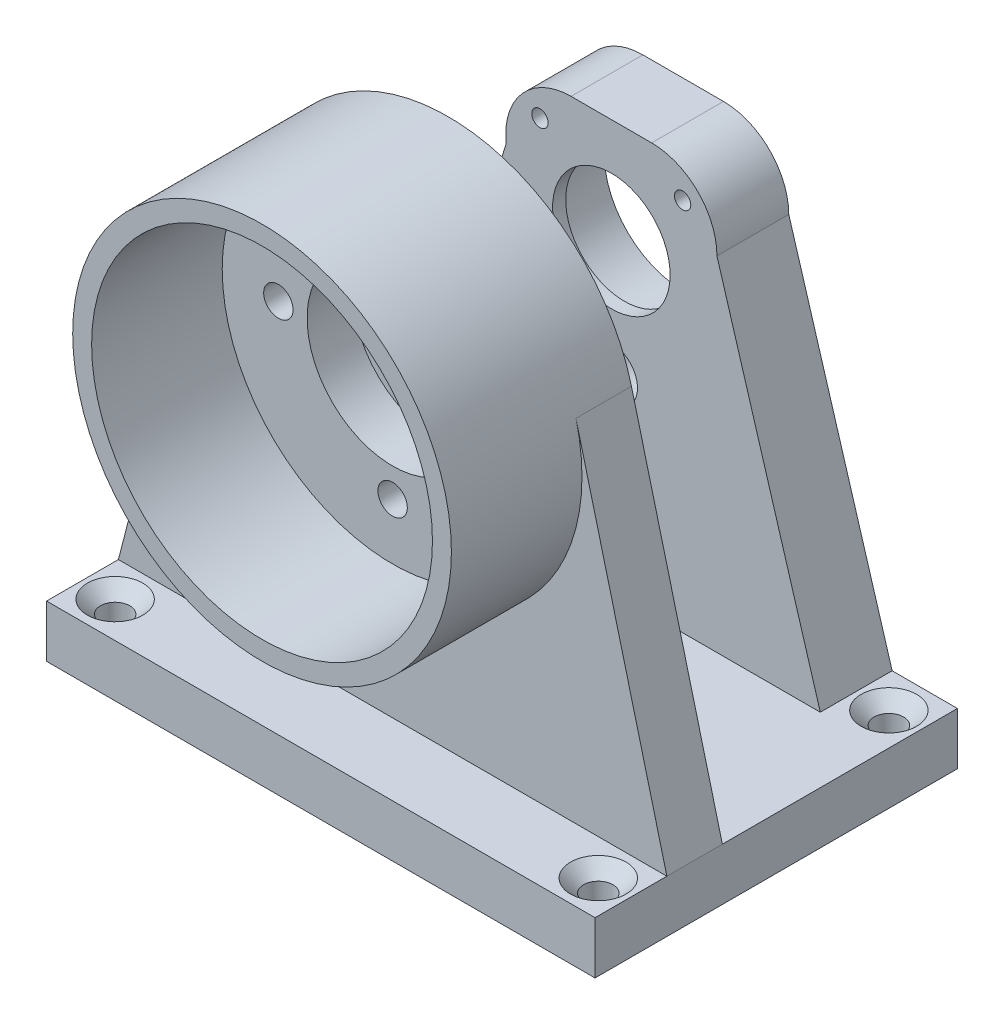
ISO-10303-21;
HEADER;
FILE_DESCRIPTION(('STEP AP214'),'2;1');
FILE_NAME('part.step','',(''),(''),'','','');
FILE_SCHEMA(('AUTOMOTIVE_DESIGN { 1 0 10303 214 1 1 1 1 }'));
ENDSEC;
DATA;
#1=APPLICATION_CONTEXT('core data for automotive mechanical design processes');
#2=APPLICATION_PROTOCOL_DEFINITION('international standard','automotive_design',2000,#1);
#3=PRODUCT_CONTEXT('',#1,'mechanical');
#4=PRODUCT('Part','Part','',(#3));
#5=PRODUCT_RELATED_PRODUCT_CATEGORY('part','',(#4));
#6=PRODUCT_DEFINITION_FORMATION('','',#4);
#7=PRODUCT_DEFINITION_CONTEXT('part definition',#1,'design');
#8=PRODUCT_DEFINITION('design','',#6,#7);
#9=PRODUCT_DEFINITION_SHAPE('','',#8);
#10=(LENGTH_UNIT() NAMED_UNIT(*) SI_UNIT(.MILLI.,.METRE.));
#11=(NAMED_UNIT(*) PLANE_ANGLE_UNIT() SI_UNIT($,.RADIAN.));
#12=(NAMED_UNIT(*) SI_UNIT($,.STERADIAN.) SOLID_ANGLE_UNIT());
#13=UNCERTAINTY_MEASURE_WITH_UNIT(LENGTH_MEASURE(1.E-05),#10,'distance_accuracy_value','');
#14=(GEOMETRIC_REPRESENTATION_CONTEXT(3) GLOBAL_UNCERTAINTY_ASSIGNED_CONTEXT((#13)) GLOBAL_UNIT_ASSIGNED_CONTEXT((#10,
#11,#12)) REPRESENTATION_CONTEXT('',''));
#15=CARTESIAN_POINT('',(0.,0.,0.));
#16=DIRECTION('',(0.,0.,1.));
#17=DIRECTION('',(1.,0.,0.));
#18=AXIS2_PLACEMENT_3D('',#15,#16,#17);
#19=CARTESIAN_POINT('',(0.,0.,44.5));
#20=DIRECTION('',(0.,0.,1.));
#21=DIRECTION('',(1.,0.,0.));
#22=AXIS2_PLACEMENT_3D('',#19,#20,#21);
#23=PLANE('',#22);
#24=CARTESIAN_POINT('',(0.,0.,44.5));
#25=DIRECTION('',(0.,0.,1.));
#26=DIRECTION('',(1.,0.,0.));
#27=AXIS2_PLACEMENT_3D('',#24,#25,#26);
#28=CIRCLE('',#27,13.1);
#29=CARTESIAN_POINT('',(13.1,0.,44.5));
#30=VERTEX_POINT('',#29);
#31=EDGE_CURVE('E264',#30,#30,#28,.T.);
#32=ORIENTED_EDGE('',*,*,#31,.F.);
#33=EDGE_LOOP('',(#32));
#34=FACE_BOUND('',#33,.T.);
#35=CARTESIAN_POINT('',(0.,17.5,44.5));
#36=DIRECTION('',(0.,0.,1.));
#37=DIRECTION('',(1.,0.,0.));
#38=AXIS2_PLACEMENT_3D('',#35,#36,#37);
#39=CIRCLE('',#38,2.25);
#40=CARTESIAN_POINT('',(2.25,17.5,44.5));
#41=VERTEX_POINT('',#40);
#42=EDGE_CURVE('E272',#41,#41,#39,.T.);
#43=ORIENTED_EDGE('',*,*,#42,.F.);
#44=EDGE_LOOP('',(#43));
#45=FACE_BOUND('',#44,.T.);
#46=CARTESIAN_POINT('',(0.,-17.5,44.5));
#47=DIRECTION('',(0.,0.,1.));
#48=DIRECTION('',(1.,0.,0.));
#49=AXIS2_PLACEMENT_3D('',#46,#47,#48);
#50=CIRCLE('',#49,2.25);
#51=CARTESIAN_POINT('',(2.25,-17.5,44.5));
#52=VERTEX_POINT('',#51);
#53=EDGE_CURVE('E278',#52,#52,#50,.T.);
#54=ORIENTED_EDGE('',*,*,#53,.F.);
#55=EDGE_LOOP('',(#54));
#56=FACE_BOUND('',#55,.T.);
#57=CARTESIAN_POINT('',(17.5,0.,44.5));
#58=DIRECTION('',(0.,0.,1.));
#59=DIRECTION('',(1.,0.,0.));
#60=AXIS2_PLACEMENT_3D('',#57,#58,#59);
#61=CIRCLE('',#60,2.25);
#62=CARTESIAN_POINT('',(19.75,0.,44.5));
#63=VERTEX_POINT('',#62);
#64=EDGE_CURVE('E275',#63,#63,#61,.T.);
#65=ORIENTED_EDGE('',*,*,#64,.F.);
#66=EDGE_LOOP('',(#65));
#67=FACE_BOUND('',#66,.T.);
#68=CARTESIAN_POINT('',(-17.5,0.,44.5));
#69=DIRECTION('',(0.,0.,1.));
#70=DIRECTION('',(1.,0.,0.));
#71=AXIS2_PLACEMENT_3D('',#68,#69,#70);
#72=CIRCLE('',#71,2.25);
#73=CARTESIAN_POINT('',(-15.25,0.,44.5));
#74=VERTEX_POINT('',#73);
#75=EDGE_CURVE('E267',#74,#74,#72,.T.);
#76=ORIENTED_EDGE('',*,*,#75,.F.);
#77=EDGE_LOOP('',(#76));
#78=FACE_BOUND('',#77,.T.);
#79=CARTESIAN_POINT('',(0.,0.,44.5));
#80=DIRECTION('',(0.,0.,1.));
#81=DIRECTION('',(1.,0.,0.));
#82=AXIS2_PLACEMENT_3D('',#79,#80,#81);
#83=CIRCLE('',#82,26.1);
#84=CARTESIAN_POINT('',(26.1,0.,44.5));
#85=VERTEX_POINT('',#84);
#86=EDGE_CURVE('E250',#85,#85,#83,.T.);
#87=ORIENTED_EDGE('',*,*,#86,.T.);
#88=EDGE_LOOP('',(#87));
#89=FACE_BOUND('',#88,.T.);
#90=ADVANCED_FACE('F36',(#34,#45,#56,#67,#78,#89),#23,.T.);
#91=CARTESIAN_POINT('',(0.,0.,37.5));
#92=DIRECTION('',(0.,0.,1.));
#93=DIRECTION('',(1.,0.,0.));
#94=AXIS2_PLACEMENT_3D('',#91,#92,#93);
#95=PLANE('',#94);
#96=CARTESIAN_POINT('',(0.,0.,37.5));
#97=DIRECTION('',(0.,0.,1.));
#98=DIRECTION('',(1.,0.,0.));
#99=AXIS2_PLACEMENT_3D('',#96,#97,#98);
#100=CIRCLE('',#99,6.);
#101=CARTESIAN_POINT('',(6.,0.,37.5));
#102=VERTEX_POINT('',#101);
#103=EDGE_CURVE('E288',#102,#102,#100,.T.);
#104=ORIENTED_EDGE('',*,*,#103,.F.);
#105=EDGE_LOOP('',(#104));
#106=FACE_BOUND('',#105,.T.);
#107=CARTESIAN_POINT('',(0.,0.,37.5));
#108=DIRECTION('',(0.,0.,1.));
#109=DIRECTION('',(1.,0.,0.));
#110=AXIS2_PLACEMENT_3D('',#107,#108,#109);
#111=CIRCLE('',#110,13.1);
#112=CARTESIAN_POINT('',(13.1,0.,37.5));
#113=VERTEX_POINT('',#112);
#114=EDGE_CURVE('E261',#113,#113,#111,.T.);
#115=ORIENTED_EDGE('',*,*,#114,.T.);
#116=EDGE_LOOP('',(#115));
#117=FACE_BOUND('',#116,.T.);
#118=ADVANCED_FACE('F447',(#106,#117),#95,.T.);
#119=CARTESIAN_POINT('',(0.,0.,11.));
#120=DIRECTION('',(0.,0.,-1.));
#121=DIRECTION('',(-1.,0.,0.));
#122=AXIS2_PLACEMENT_3D('',#119,#120,#121);
#123=CYLINDRICAL_SURFACE('',#122,12.1);
#124=CARTESIAN_POINT('',(0.,0.,0.));
#125=DIRECTION('',(0.,0.,1.));
#126=DIRECTION('',(1.,0.,0.));
#127=AXIS2_PLACEMENT_3D('',#124,#125,#126);
#128=CIRCLE('',#127,12.1);
#129=CARTESIAN_POINT('',(12.1,0.,0.));
#130=VERTEX_POINT('',#129);
#131=EDGE_CURVE('E146',#130,#130,#128,.T.);
#132=ORIENTED_EDGE('',*,*,#131,.F.);
#133=EDGE_LOOP('',(#132));
#134=FACE_BOUND('',#133,.T.);
#135=CARTESIAN_POINT('',(0.,0.,9.));
#136=DIRECTION('',(0.,0.,1.));
#137=DIRECTION('',(1.,0.,0.));
#138=AXIS2_PLACEMENT_3D('',#135,#136,#137);
#139=CIRCLE('',#138,12.1);
#140=CARTESIAN_POINT('',(12.1,0.,9.));
#141=VERTEX_POINT('',#140);
#142=EDGE_CURVE('E352',#141,#141,#139,.T.);
#143=ORIENTED_EDGE('',*,*,#142,.T.);
#144=EDGE_LOOP('',(#143));
#145=FACE_BOUND('',#144,.T.);
#146=ADVANCED_FACE('F453',(#134,#145),#123,.F.);
#147=CARTESIAN_POINT('',(6.17131132464449,6.1,11.));
#148=DIRECTION('',(0.,0.,1.));
#149=DIRECTION('',(1.,0.,0.));
#150=AXIS2_PLACEMENT_3D('',#147,#148,#149);
#151=PLANE('',#150);
#152=CARTESIAN_POINT('',(0.,-17.5,11.));
#153=DIRECTION('',(0.,0.,1.));
#154=DIRECTION('',(1.,0.,0.));
#155=AXIS2_PLACEMENT_3D('',#152,#153,#154);
#156=CIRCLE('',#155,4.);
#157=CARTESIAN_POINT('',(4.,-17.5,11.));
#158=VERTEX_POINT('',#157);
#159=EDGE_CURVE('E246',#158,#158,#156,.F.);
#160=ORIENTED_EDGE('',*,*,#159,.T.);
#161=EDGE_LOOP('',(#160));
#162=FACE_BOUND('',#161,.T.);
#163=DIRECTION('',(-1.,0.,0.));
#164=VECTOR('',#163,1.);
#165=CARTESIAN_POINT('',(-42.,-46.5,11.));
#166=LINE('',#165,#164);
#167=CARTESIAN_POINT('',(32.,-46.5,11.));
#168=VERTEX_POINT('',#167);
#169=CARTESIAN_POINT('',(-32.,-46.5,11.));
#170=VERTEX_POINT('',#169);
#171=EDGE_CURVE('E103',#168,#170,#166,.T.);
#172=ORIENTED_EDGE('',*,*,#171,.F.);
#173=DIRECTION('',(-0.288160971359315,0.957581983218803,0.));
#174=VECTOR('',#173,1.);
#175=CARTESIAN_POINT('',(32.,-46.5,11.));
#176=LINE('',#175,#174);
#177=CARTESIAN_POINT('',(16.1713113246445,6.09999999999993,11.));
#178=VERTEX_POINT('',#177);
#179=EDGE_CURVE('E161',#168,#178,#176,.T.);
#180=ORIENTED_EDGE('',*,*,#179,.T.);
#181=CARTESIAN_POINT('',(6.17131132464449,6.1,11.));
#182=DIRECTION('',(0.,0.,1.));
#183=DIRECTION('',(1.,0.,0.));
#184=AXIS2_PLACEMENT_3D('',#181,#182,#183);
#185=CIRCLE('',#184,10.);
#186=CARTESIAN_POINT('',(6.17131132464449,16.1,11.));
#187=VERTEX_POINT('',#186);
#188=EDGE_CURVE('E121',#178,#187,#185,.T.);
#189=ORIENTED_EDGE('',*,*,#188,.T.);
#190=DIRECTION('',(-1.,0.,0.));
#191=VECTOR('',#190,1.);
#192=CARTESIAN_POINT('',(-6.17131132464449,16.1,11.));
#193=LINE('',#192,#191);
#194=CARTESIAN_POINT('',(-6.17131132464449,16.1,11.));
#195=VERTEX_POINT('',#194);
#196=EDGE_CURVE('E113',#187,#195,#193,.T.);
#197=ORIENTED_EDGE('',*,*,#196,.T.);
#198=CARTESIAN_POINT('',(-6.17131132464449,6.1,11.));
#199=DIRECTION('',(0.,0.,1.));
#200=DIRECTION('',(-1.,0.,0.));
#201=AXIS2_PLACEMENT_3D('',#198,#199,#200);
#202=CIRCLE('',#201,10.);
#203=CARTESIAN_POINT('',(-16.1,4.90788373559151,11.));
#204=VERTEX_POINT('',#203);
#205=EDGE_CURVE('E118',#195,#204,#202,.T.);
#206=ORIENTED_EDGE('',*,*,#205,.T.);
#207=DIRECTION('',(-0.295480824322665,-0.95534867062115,0.));
#208=VECTOR('',#207,1.);
#209=CARTESIAN_POINT('',(-32.,-46.5,11.));
#210=LINE('',#209,#208);
#211=EDGE_CURVE('E54',#204,#170,#210,.T.);
#212=ORIENTED_EDGE('',*,*,#211,.T.);
#213=EDGE_LOOP('',(#172,#180,#189,#197,#206,#212));
#214=FACE_BOUND('',#213,.T.);
#215=CARTESIAN_POINT('',(10.9107197436623,10.8519646008193,11.));
#216=DIRECTION('',(0.,0.,-1.));
#217=DIRECTION('',(-1.,0.,0.));
#218=AXIS2_PLACEMENT_3D('',#215,#216,#217);
#219=CIRCLE('',#218,1.25);
#220=CARTESIAN_POINT('',(9.66071974366226,10.8519646008193,11.));
#221=VERTEX_POINT('',#220);
#222=EDGE_CURVE('E331',#221,#221,#219,.T.);
#223=ORIENTED_EDGE('',*,*,#222,.T.);
#224=EDGE_LOOP('',(#223));
#225=FACE_BOUND('',#224,.T.);
#226=CARTESIAN_POINT('',(-10.9444590620381,10.8179926058548,11.));
#227=DIRECTION('',(0.,0.,-1.));
#228=DIRECTION('',(-1.,0.,0.));
#229=AXIS2_PLACEMENT_3D('',#226,#227,#228);
#230=CIRCLE('',#229,1.25);
#231=CARTESIAN_POINT('',(-12.1944590620381,10.8179926058548,11.));
#232=VERTEX_POINT('',#231);
#233=EDGE_CURVE('E338',#232,#232,#230,.T.);
#234=ORIENTED_EDGE('',*,*,#233,.T.);
#235=EDGE_LOOP('',(#234));
#236=FACE_BOUND('',#235,.T.);
#237=CARTESIAN_POINT('',(0.,0.,11.));
#238=DIRECTION('',(0.,0.,1.));
#239=DIRECTION('',(1.,0.,0.));
#240=AXIS2_PLACEMENT_3D('',#237,#238,#239);
#241=CIRCLE('',#240,9.);
#242=CARTESIAN_POINT('',(9.,0.,11.));
#243=VERTEX_POINT('',#242);
#244=EDGE_CURVE('E346',#243,#243,#241,.T.);
#245=ORIENTED_EDGE('',*,*,#244,.F.);
#246=EDGE_LOOP('',(#245));
#247=FACE_BOUND('',#246,.T.);
#248=ADVANCED_FACE('F115',(#162,#214,#225,#236,#247),#151,.T.);
#249=CARTESIAN_POINT('',(6.17131132464449,6.1,0.));
#250=DIRECTION('',(0.,0.,1.));
#251=DIRECTION('',(1.,0.,0.));
#252=AXIS2_PLACEMENT_3D('',#249,#250,#251);
#253=PLANE('',#252);
#254=CARTESIAN_POINT('',(0.,-17.5,0.));
#255=DIRECTION('',(0.,0.,-1.));
#256=DIRECTION('',(-1.,0.,0.));
#257=AXIS2_PLACEMENT_3D('',#254,#255,#256);
#258=CIRCLE('',#257,4.);
#259=CARTESIAN_POINT('',(-4.,-17.5,0.));
#260=VERTEX_POINT('',#259);
#261=EDGE_CURVE('E247',#260,#260,#258,.T.);
#262=ORIENTED_EDGE('',*,*,#261,.F.);
#263=EDGE_LOOP('',(#262));
#264=FACE_BOUND('',#263,.T.);
#265=CARTESIAN_POINT('',(10.9107197436623,10.8519646008193,0.));
#266=DIRECTION('',(0.,0.,-1.));
#267=DIRECTION('',(-1.,0.,0.));
#268=AXIS2_PLACEMENT_3D('',#265,#266,#267);
#269=CIRCLE('',#268,1.25);
#270=CARTESIAN_POINT('',(9.66071974366226,10.8519646008193,0.));
#271=VERTEX_POINT('',#270);
#272=EDGE_CURVE('E335',#271,#271,#269,.T.);
#273=ORIENTED_EDGE('',*,*,#272,.F.);
#274=EDGE_LOOP('',(#273));
#275=FACE_BOUND('',#274,.T.);
#276=CARTESIAN_POINT('',(-10.9444590620381,10.8179926058548,0.));
#277=DIRECTION('',(0.,0.,-1.));
#278=DIRECTION('',(-1.,0.,0.));
#279=AXIS2_PLACEMENT_3D('',#276,#277,#278);
#280=CIRCLE('',#279,1.25);
#281=CARTESIAN_POINT('',(-12.1944590620381,10.8179926058548,0.));
#282=VERTEX_POINT('',#281);
#283=EDGE_CURVE('E329',#282,#282,#280,.T.);
#284=ORIENTED_EDGE('',*,*,#283,.F.);
#285=EDGE_LOOP('',(#284));
#286=FACE_BOUND('',#285,.T.);
#287=DIRECTION('',(0.,1.,0.));
#288=VECTOR('',#287,1.);
#289=CARTESIAN_POINT('',(42.,-54.5,0.));
#290=LINE('',#289,#288);
#291=CARTESIAN_POINT('',(42.,-54.5,0.));
#292=VERTEX_POINT('',#291);
#293=CARTESIAN_POINT('',(42.,-46.5,0.));
#294=VERTEX_POINT('',#293);
#295=EDGE_CURVE('E143',#292,#294,#290,.T.);
#296=ORIENTED_EDGE('',*,*,#295,.F.);
#297=DIRECTION('',(1.,0.,0.));
#298=VECTOR('',#297,1.);
#299=CARTESIAN_POINT('',(-17.,-54.5,0.));
#300=LINE('',#299,#298);
#301=CARTESIAN_POINT('',(-42.,-54.5,0.));
#302=VERTEX_POINT('',#301);
#303=EDGE_CURVE('E97',#302,#292,#300,.T.);
#304=ORIENTED_EDGE('',*,*,#303,.F.);
#305=DIRECTION('',(0.,-1.,0.));
#306=VECTOR('',#305,1.);
#307=CARTESIAN_POINT('',(-42.,-54.5,0.));
#308=LINE('',#307,#306);
#309=CARTESIAN_POINT('',(-42.,-46.5,0.));
#310=VERTEX_POINT('',#309);
#311=EDGE_CURVE('E158',#310,#302,#308,.T.);
#312=ORIENTED_EDGE('',*,*,#311,.F.);
#313=DIRECTION('',(-1.,0.,0.));
#314=VECTOR('',#313,1.);
#315=CARTESIAN_POINT('',(-42.,-46.5,0.));
#316=LINE('',#315,#314);
#317=CARTESIAN_POINT('',(-32.,-46.5,0.));
#318=VERTEX_POINT('',#317);
#319=EDGE_CURVE('E90',#318,#310,#316,.T.);
#320=ORIENTED_EDGE('',*,*,#319,.F.);
#321=DIRECTION('',(-0.295480824322665,-0.95534867062115,0.));
#322=VECTOR('',#321,1.);
#323=CARTESIAN_POINT('',(-32.,-46.5,0.));
#324=LINE('',#323,#322);
#325=CARTESIAN_POINT('',(-16.1,4.90788373559151,0.));
#326=VERTEX_POINT('',#325);
#327=EDGE_CURVE('E155',#326,#318,#324,.T.);
#328=ORIENTED_EDGE('',*,*,#327,.F.);
#329=CARTESIAN_POINT('',(-6.17131132464449,6.1,0.));
#330=DIRECTION('',(0.,0.,1.));
#331=DIRECTION('',(-1.,0.,0.));
#332=AXIS2_PLACEMENT_3D('',#329,#330,#331);
#333=CIRCLE('',#332,10.);
#334=CARTESIAN_POINT('',(-6.17131132464449,16.1,0.));
#335=VERTEX_POINT('',#334);
#336=EDGE_CURVE('E153',#335,#326,#333,.T.);
#337=ORIENTED_EDGE('',*,*,#336,.F.);
#338=DIRECTION('',(-1.,0.,0.));
#339=VECTOR('',#338,1.);
#340=CARTESIAN_POINT('',(-6.17131132464449,16.1,0.));
#341=LINE('',#340,#339);
#342=CARTESIAN_POINT('',(6.17131132464449,16.1,0.));
#343=VERTEX_POINT('',#342);
#344=EDGE_CURVE('E130',#343,#335,#341,.T.);
#345=ORIENTED_EDGE('',*,*,#344,.F.);
#346=CARTESIAN_POINT('',(6.17131132464449,6.1,0.));
#347=DIRECTION('',(0.,0.,1.));
#348=DIRECTION('',(1.,0.,0.));
#349=AXIS2_PLACEMENT_3D('',#346,#347,#348);
#350=CIRCLE('',#349,10.);
#351=CARTESIAN_POINT('',(16.1713113246445,6.09999999999993,0.));
#352=VERTEX_POINT('',#351);
#353=EDGE_CURVE('E150',#352,#343,#350,.T.);
#354=ORIENTED_EDGE('',*,*,#353,.F.);
#355=DIRECTION('',(-0.288160971359315,0.957581983218803,0.));
#356=VECTOR('',#355,1.);
#357=CARTESIAN_POINT('',(32.,-46.5,0.));
#358=LINE('',#357,#356);
#359=CARTESIAN_POINT('',(32.,-46.5,0.));
#360=VERTEX_POINT('',#359);
#361=EDGE_CURVE('E148',#360,#352,#358,.T.);
#362=ORIENTED_EDGE('',*,*,#361,.F.);
#363=DIRECTION('',(-1.,0.,0.));
#364=VECTOR('',#363,1.);
#365=CARTESIAN_POINT('',(42.,-46.5,0.));
#366=LINE('',#365,#364);
#367=EDGE_CURVE('E145',#294,#360,#366,.T.);
#368=ORIENTED_EDGE('',*,*,#367,.F.);
#369=EDGE_LOOP('',(#296,#304,#312,#320,#328,#337,#345,#354,#362,#368));
#370=FACE_BOUND('',#369,.T.);
#371=ORIENTED_EDGE('',*,*,#131,.T.);
#372=EDGE_LOOP('',(#371));
#373=FACE_BOUND('',#372,.T.);
#374=ADVANCED_FACE('F367',(#264,#275,#286,#370,#373),#253,.F.);
#375=CARTESIAN_POINT('',(42.,-54.5,11.));
#376=DIRECTION('',(-1.,0.,0.));
#377=DIRECTION('',(0.,0.,1.));
#378=AXIS2_PLACEMENT_3D('',#375,#376,#377);
#379=PLANE('',#378);
#380=ORIENTED_EDGE('',*,*,#295,.T.);
#381=DIRECTION('',(0.,0.,-1.));
#382=VECTOR('',#381,1.);
#383=CARTESIAN_POINT('',(42.,-46.5,11.));
#384=LINE('',#383,#382);
#385=CARTESIAN_POINT('',(42.,-46.5,36.));
#386=VERTEX_POINT('',#385);
#387=EDGE_CURVE('E176',#386,#294,#384,.T.);
#388=ORIENTED_EDGE('',*,*,#387,.F.);
#389=DIRECTION('',(0.,0.,-1.));
#390=VECTOR('',#389,1.);
#391=CARTESIAN_POINT('',(42.,-46.5,37.5));
#392=LINE('',#391,#390);
#393=CARTESIAN_POINT('',(42.,-46.5,44.5));
#394=VERTEX_POINT('',#393);
#395=EDGE_CURVE('E291',#394,#386,#392,.T.);
#396=ORIENTED_EDGE('',*,*,#395,.F.);
#397=DIRECTION('',(0.,0.,-1.));
#398=VECTOR('',#397,1.);
#399=CARTESIAN_POINT('',(42.,-46.5,55.5));
#400=LINE('',#399,#398);
#401=CARTESIAN_POINT('',(42.,-46.5,55.5));
#402=VERTEX_POINT('',#401);
#403=EDGE_CURVE('E239',#402,#394,#400,.T.);
#404=ORIENTED_EDGE('',*,*,#403,.F.);
#405=DIRECTION('',(0.,1.,0.));
#406=VECTOR('',#405,1.);
#407=CARTESIAN_POINT('',(42.,0.,55.5));
#408=LINE('',#407,#406);
#409=CARTESIAN_POINT('',(42.,-54.5,55.5));
#410=VERTEX_POINT('',#409);
#411=EDGE_CURVE('E237',#410,#402,#408,.T.);
#412=ORIENTED_EDGE('',*,*,#411,.F.);
#413=DIRECTION('',(0.,0.,-1.));
#414=VECTOR('',#413,1.);
#415=CARTESIAN_POINT('',(42.,-54.5,11.));
#416=LINE('',#415,#414);
#417=EDGE_CURVE('E179',#410,#292,#416,.T.);
#418=ORIENTED_EDGE('',*,*,#417,.T.);
#419=EDGE_LOOP('',(#380,#388,#396,#404,#412,#418));
#420=FACE_BOUND('',#419,.T.);
#421=ADVANCED_FACE('F379',(#420),#379,.F.);
#422=CARTESIAN_POINT('',(32.,-46.5,11.));
#423=DIRECTION('',(-0.957581983218803,-0.288160971359315,0.));
#424=DIRECTION('',(0.288160971359315,-0.957581983218803,0.));
#425=AXIS2_PLACEMENT_3D('',#422,#423,#424);
#426=PLANE('',#425);
#427=ORIENTED_EDGE('',*,*,#361,.T.);
#428=DIRECTION('',(0.,0.,-1.));
#429=VECTOR('',#428,1.);
#430=CARTESIAN_POINT('',(16.1713113246445,6.09999999999993,11.));
#431=LINE('',#430,#429);
#432=EDGE_CURVE('E170',#178,#352,#431,.T.);
#433=ORIENTED_EDGE('',*,*,#432,.F.);
#434=ORIENTED_EDGE('',*,*,#179,.F.);
#435=DIRECTION('',(0.,0.,-1.));
#436=VECTOR('',#435,1.);
#437=CARTESIAN_POINT('',(32.,-46.5,11.));
#438=LINE('',#437,#436);
#439=EDGE_CURVE('E173',#168,#360,#438,.T.);
#440=ORIENTED_EDGE('',*,*,#439,.T.);
#441=EDGE_LOOP('',(#427,#433,#434,#440));
#442=FACE_BOUND('',#441,.T.);
#443=ADVANCED_FACE('F362',(#442),#426,.F.);
#444=CARTESIAN_POINT('',(6.17131132464449,6.1,11.));
#445=DIRECTION('',(0.,0.,-1.));
#446=DIRECTION('',(-1.,0.,0.));
#447=AXIS2_PLACEMENT_3D('',#444,#445,#446);
#448=CYLINDRICAL_SURFACE('',#447,10.);
#449=ORIENTED_EDGE('',*,*,#353,.T.);
#450=DIRECTION('',(0.,0.,-1.));
#451=VECTOR('',#450,1.);
#452=CARTESIAN_POINT('',(6.17131132464449,16.1,11.));
#453=LINE('',#452,#451);
#454=EDGE_CURVE('E133',#187,#343,#453,.T.);
#455=ORIENTED_EDGE('',*,*,#454,.F.);
#456=ORIENTED_EDGE('',*,*,#188,.F.);
#457=ORIENTED_EDGE('',*,*,#432,.T.);
#458=EDGE_LOOP('',(#449,#455,#456,#457));
#459=FACE_BOUND('',#458,.T.);
#460=ADVANCED_FACE('F366',(#459),#448,.T.);
#461=CARTESIAN_POINT('',(-6.17131132464449,16.1,11.));
#462=DIRECTION('',(0.,-1.,0.));
#463=DIRECTION('',(0.,0.,-1.));
#464=AXIS2_PLACEMENT_3D('',#461,#462,#463);
#465=PLANE('',#464);
#466=ORIENTED_EDGE('',*,*,#344,.T.);
#467=DIRECTION('',(0.,0.,-1.));
#468=VECTOR('',#467,1.);
#469=CARTESIAN_POINT('',(-6.17131132464449,16.1,11.));
#470=LINE('',#469,#468);
#471=EDGE_CURVE('E127',#195,#335,#470,.T.);
#472=ORIENTED_EDGE('',*,*,#471,.F.);
#473=ORIENTED_EDGE('',*,*,#196,.F.);
#474=ORIENTED_EDGE('',*,*,#454,.T.);
#475=EDGE_LOOP('',(#466,#472,#473,#474));
#476=FACE_BOUND('',#475,.T.);
#477=ADVANCED_FACE('F128',(#476),#465,.F.);
#478=CARTESIAN_POINT('',(-6.17131132464449,6.1,11.));
#479=DIRECTION('',(0.,0.,-1.));
#480=DIRECTION('',(-1.,0.,0.));
#481=AXIS2_PLACEMENT_3D('',#478,#479,#480);
#482=CYLINDRICAL_SURFACE('',#481,10.);
#483=ORIENTED_EDGE('',*,*,#336,.T.);
#484=DIRECTION('',(0.,0.,-1.));
#485=VECTOR('',#484,1.);
#486=CARTESIAN_POINT('',(-16.1,4.90788373559151,11.));
#487=LINE('',#486,#485);
#488=EDGE_CURVE('E134',#204,#326,#487,.T.);
#489=ORIENTED_EDGE('',*,*,#488,.F.);
#490=ORIENTED_EDGE('',*,*,#205,.F.);
#491=ORIENTED_EDGE('',*,*,#471,.T.);
#492=EDGE_LOOP('',(#483,#489,#490,#491));
#493=FACE_BOUND('',#492,.T.);
#494=ADVANCED_FACE('F136',(#493),#482,.T.);
#495=CARTESIAN_POINT('',(-32.,-46.5,11.));
#496=DIRECTION('',(0.95534867062115,-0.295480824322665,0.));
#497=DIRECTION('',(0.295480824322665,0.95534867062115,0.));
#498=AXIS2_PLACEMENT_3D('',#495,#496,#497);
#499=PLANE('',#498);
#500=ORIENTED_EDGE('',*,*,#327,.T.);
#501=DIRECTION('',(0.,0.,-1.));
#502=VECTOR('',#501,1.);
#503=CARTESIAN_POINT('',(-32.,-46.5,11.));
#504=LINE('',#503,#502);
#505=EDGE_CURVE('E166',#170,#318,#504,.T.);
#506=ORIENTED_EDGE('',*,*,#505,.F.);
#507=ORIENTED_EDGE('',*,*,#211,.F.);
#508=ORIENTED_EDGE('',*,*,#488,.T.);
#509=EDGE_LOOP('',(#500,#506,#507,#508));
#510=FACE_BOUND('',#509,.T.);
#511=ADVANCED_FACE('F371',(#510),#499,.F.);
#512=CARTESIAN_POINT('',(-42.,-46.5,11.));
#513=DIRECTION('',(0.,-1.,0.));
#514=DIRECTION('',(0.,0.,-1.));
#515=AXIS2_PLACEMENT_3D('',#512,#513,#514);
#516=PLANE('',#515);
#517=CARTESIAN_POINT('',(-37.,-46.5,5.5));
#518=DIRECTION('',(0.,-1.,0.));
#519=DIRECTION('',(0.,0.,-1.));
#520=AXIS2_PLACEMENT_3D('',#517,#518,#519);
#521=CIRCLE('',#520,4.25000000000005);
#522=CARTESIAN_POINT('',(-37.,-46.5,1.24999999999995));
#523=VERTEX_POINT('',#522);
#524=EDGE_CURVE('E185',#523,#523,#521,.T.);
#525=ORIENTED_EDGE('',*,*,#524,.T.);
#526=EDGE_LOOP('',(#525));
#527=FACE_BOUND('',#526,.T.);
#528=ORIENTED_EDGE('',*,*,#319,.T.);
#529=DIRECTION('',(0.,0.,-1.));
#530=VECTOR('',#529,1.);
#531=CARTESIAN_POINT('',(-42.,-46.5,11.));
#532=LINE('',#531,#530);
#533=CARTESIAN_POINT('',(-42.,-46.5,36.));
#534=VERTEX_POINT('',#533);
#535=EDGE_CURVE('E164',#534,#310,#532,.T.);
#536=ORIENTED_EDGE('',*,*,#535,.F.);
#537=DIRECTION('',(-1.,0.,0.));
#538=VECTOR('',#537,1.);
#539=CARTESIAN_POINT('',(-42.,-46.5,36.));
#540=LINE('',#539,#538);
#541=EDGE_CURVE('E326',#386,#534,#540,.T.);
#542=ORIENTED_EDGE('',*,*,#541,.F.);
#543=ORIENTED_EDGE('',*,*,#387,.T.);
#544=ORIENTED_EDGE('',*,*,#367,.T.);
#545=ORIENTED_EDGE('',*,*,#439,.F.);
#546=ORIENTED_EDGE('',*,*,#171,.T.);
#547=ORIENTED_EDGE('',*,*,#505,.T.);
#548=EDGE_LOOP('',(#528,#536,#542,#543,#544,#545,#546,#547));
#549=FACE_BOUND('',#548,.T.);
#550=CARTESIAN_POINT('',(37.,-46.5,5.5));
#551=DIRECTION('',(0.,-1.,0.));
#552=DIRECTION('',(0.,0.,-1.));
#553=AXIS2_PLACEMENT_3D('',#550,#551,#552);
#554=CIRCLE('',#553,4.25000000000005);
#555=CARTESIAN_POINT('',(37.,-46.5,1.24999999999995));
#556=VERTEX_POINT('',#555);
#557=EDGE_CURVE('E191',#556,#556,#554,.T.);
#558=ORIENTED_EDGE('',*,*,#557,.T.);
#559=EDGE_LOOP('',(#558));
#560=FACE_BOUND('',#559,.T.);
#561=ADVANCED_FACE('F372',(#527,#549,#560),#516,.F.);
#562=CARTESIAN_POINT('',(-42.,-54.5,11.));
#563=DIRECTION('',(1.,0.,0.));
#564=DIRECTION('',(0.,0.,-1.));
#565=AXIS2_PLACEMENT_3D('',#562,#563,#564);
#566=PLANE('',#565);
#567=ORIENTED_EDGE('',*,*,#311,.T.);
#568=DIRECTION('',(0.,0.,-1.));
#569=VECTOR('',#568,1.);
#570=CARTESIAN_POINT('',(-42.,-54.5,11.));
#571=LINE('',#570,#569);
#572=CARTESIAN_POINT('',(-42.,-54.5,55.5));
#573=VERTEX_POINT('',#572);
#574=EDGE_CURVE('E139',#573,#302,#571,.T.);
#575=ORIENTED_EDGE('',*,*,#574,.F.);
#576=DIRECTION('',(0.,-1.,0.));
#577=VECTOR('',#576,1.);
#578=CARTESIAN_POINT('',(-42.,0.,55.5));
#579=LINE('',#578,#577);
#580=CARTESIAN_POINT('',(-42.,-46.5,55.5));
#581=VERTEX_POINT('',#580);
#582=EDGE_CURVE('E231',#581,#573,#579,.T.);
#583=ORIENTED_EDGE('',*,*,#582,.F.);
#584=DIRECTION('',(0.,0.,-1.));
#585=VECTOR('',#584,1.);
#586=CARTESIAN_POINT('',(-42.,-46.5,55.5));
#587=LINE('',#586,#585);
#588=CARTESIAN_POINT('',(-42.,-46.5,44.5));
#589=VERTEX_POINT('',#588);
#590=EDGE_CURVE('E243',#581,#589,#587,.T.);
#591=ORIENTED_EDGE('',*,*,#590,.T.);
#592=DIRECTION('',(0.,0.,-1.));
#593=VECTOR('',#592,1.);
#594=CARTESIAN_POINT('',(-42.,-46.5,37.5));
#595=LINE('',#594,#593);
#596=EDGE_CURVE('E317',#589,#534,#595,.T.);
#597=ORIENTED_EDGE('',*,*,#596,.T.);
#598=ORIENTED_EDGE('',*,*,#535,.T.);
#599=EDGE_LOOP('',(#567,#575,#583,#591,#597,#598));
#600=FACE_BOUND('',#599,.T.);
#601=ADVANCED_FACE('F396',(#600),#566,.F.);
#602=CARTESIAN_POINT('',(-17.,-54.5,11.));
#603=DIRECTION('',(0.,1.,0.));
#604=DIRECTION('',(0.,0.,1.));
#605=AXIS2_PLACEMENT_3D('',#602,#603,#604);
#606=PLANE('',#605);
#607=CARTESIAN_POINT('',(-37.,-54.5,50.));
#608=DIRECTION('',(0.,1.,0.));
#609=DIRECTION('',(0.,0.,1.));
#610=AXIS2_PLACEMENT_3D('',#607,#608,#609);
#611=CIRCLE('',#610,2.25);
#612=CARTESIAN_POINT('',(-37.,-54.5,52.25));
#613=VERTEX_POINT('',#612);
#614=EDGE_CURVE('E218',#613,#613,#611,.T.);
#615=ORIENTED_EDGE('',*,*,#614,.T.);
#616=EDGE_LOOP('',(#615));
#617=FACE_BOUND('',#616,.T.);
#618=CARTESIAN_POINT('',(37.,-54.5,50.));
#619=DIRECTION('',(0.,1.,0.));
#620=DIRECTION('',(0.,0.,1.));
#621=AXIS2_PLACEMENT_3D('',#618,#619,#620);
#622=CIRCLE('',#621,2.25);
#623=CARTESIAN_POINT('',(37.,-54.5,52.25));
#624=VERTEX_POINT('',#623);
#625=EDGE_CURVE('E221',#624,#624,#622,.T.);
#626=ORIENTED_EDGE('',*,*,#625,.T.);
#627=EDGE_LOOP('',(#626));
#628=FACE_BOUND('',#627,.T.);
#629=CARTESIAN_POINT('',(37.,-54.5,5.5));
#630=DIRECTION('',(0.,1.,0.));
#631=DIRECTION('',(0.,0.,1.));
#632=AXIS2_PLACEMENT_3D('',#629,#630,#631);
#633=CIRCLE('',#632,2.25);
#634=CARTESIAN_POINT('',(37.,-54.5,7.75));
#635=VERTEX_POINT('',#634);
#636=EDGE_CURVE('E343',#635,#635,#633,.T.);
#637=ORIENTED_EDGE('',*,*,#636,.T.);
#638=EDGE_LOOP('',(#637));
#639=FACE_BOUND('',#638,.T.);
#640=CARTESIAN_POINT('',(-37.,-54.5,5.5));
#641=DIRECTION('',(0.,1.,0.));
#642=DIRECTION('',(0.,0.,1.));
#643=AXIS2_PLACEMENT_3D('',#640,#641,#642);
#644=CIRCLE('',#643,2.25);
#645=CARTESIAN_POINT('',(-37.,-54.5,7.75));
#646=VERTEX_POINT('',#645);
#647=EDGE_CURVE('E334',#646,#646,#644,.T.);
#648=ORIENTED_EDGE('',*,*,#647,.T.);
#649=EDGE_LOOP('',(#648));
#650=FACE_BOUND('',#649,.T.);
#651=ORIENTED_EDGE('',*,*,#303,.T.);
#652=ORIENTED_EDGE('',*,*,#417,.F.);
#653=DIRECTION('',(1.,0.,0.));
#654=VECTOR('',#653,1.);
#655=CARTESIAN_POINT('',(0.,-54.5,55.5));
#656=LINE('',#655,#654);
#657=EDGE_CURVE('E234',#573,#410,#656,.T.);
#658=ORIENTED_EDGE('',*,*,#657,.F.);
#659=ORIENTED_EDGE('',*,*,#574,.T.);
#660=EDGE_LOOP('',(#651,#652,#658,#659));
#661=FACE_BOUND('',#660,.T.);
#662=ADVANCED_FACE('F384',(#617,#628,#639,#650,#661),#606,.F.);
#663=CARTESIAN_POINT('',(0.,0.,9.));
#664=DIRECTION('',(0.,0.,1.));
#665=DIRECTION('',(1.,0.,0.));
#666=AXIS2_PLACEMENT_3D('',#663,#664,#665);
#667=PLANE('',#666);
#668=CARTESIAN_POINT('',(0.,0.,9.));
#669=DIRECTION('',(0.,0.,1.));
#670=DIRECTION('',(1.,0.,0.));
#671=AXIS2_PLACEMENT_3D('',#668,#669,#670);
#672=CIRCLE('',#671,9.);
#673=CARTESIAN_POINT('',(9.,0.,9.));
#674=VERTEX_POINT('',#673);
#675=EDGE_CURVE('E349',#674,#674,#672,.T.);
#676=ORIENTED_EDGE('',*,*,#675,.T.);
#677=EDGE_LOOP('',(#676));
#678=FACE_BOUND('',#677,.T.);
#679=ORIENTED_EDGE('',*,*,#142,.F.);
#680=EDGE_LOOP('',(#679));
#681=FACE_BOUND('',#680,.T.);
#682=ADVANCED_FACE('F520',(#678,#681),#667,.F.);
#683=CARTESIAN_POINT('',(0.,0.,9.));
#684=DIRECTION('',(0.,0.,1.));
#685=DIRECTION('',(1.,0.,0.));
#686=AXIS2_PLACEMENT_3D('',#683,#684,#685);
#687=CYLINDRICAL_SURFACE('',#686,9.);
#688=ORIENTED_EDGE('',*,*,#675,.F.);
#689=EDGE_LOOP('',(#688));
#690=FACE_BOUND('',#689,.T.);
#691=ORIENTED_EDGE('',*,*,#244,.T.);
#692=EDGE_LOOP('',(#691));
#693=FACE_BOUND('',#692,.T.);
#694=ADVANCED_FACE('F516',(#690,#693),#687,.F.);
#695=CARTESIAN_POINT('',(-37.,-54.5,5.5));
#696=DIRECTION('',(0.,1.,0.));
#697=DIRECTION('',(0.,0.,1.));
#698=AXIS2_PLACEMENT_3D('',#695,#696,#697);
#699=CYLINDRICAL_SURFACE('',#698,2.25);
#700=CARTESIAN_POINT('',(-37.,-48.5,5.5));
#701=DIRECTION('',(0.,-1.,0.));
#702=DIRECTION('',(0.,0.,-1.));
#703=AXIS2_PLACEMENT_3D('',#700,#701,#702);
#704=CIRCLE('',#703,2.25);
#705=CARTESIAN_POINT('',(-37.,-48.5,3.25));
#706=VERTEX_POINT('',#705);
#707=EDGE_CURVE('E182',#706,#706,#704,.F.);
#708=ORIENTED_EDGE('',*,*,#707,.T.);
#709=EDGE_LOOP('',(#708));
#710=FACE_BOUND('',#709,.T.);
#711=ORIENTED_EDGE('',*,*,#647,.F.);
#712=EDGE_LOOP('',(#711));
#713=FACE_BOUND('',#712,.T.);
#714=ADVANCED_FACE('F512',(#710,#713),#699,.F.);
#715=CARTESIAN_POINT('',(37.,-54.5,5.5));
#716=DIRECTION('',(0.,1.,0.));
#717=DIRECTION('',(0.,0.,1.));
#718=AXIS2_PLACEMENT_3D('',#715,#716,#717);
#719=CYLINDRICAL_SURFACE('',#718,2.25);
#720=CARTESIAN_POINT('',(37.,-48.5,5.5));
#721=DIRECTION('',(0.,-1.,0.));
#722=DIRECTION('',(0.,0.,-1.));
#723=AXIS2_PLACEMENT_3D('',#720,#721,#722);
#724=CIRCLE('',#723,2.25);
#725=CARTESIAN_POINT('',(37.,-48.5,3.25));
#726=VERTEX_POINT('',#725);
#727=EDGE_CURVE('E188',#726,#726,#724,.F.);
#728=ORIENTED_EDGE('',*,*,#727,.T.);
#729=EDGE_LOOP('',(#728));
#730=FACE_BOUND('',#729,.T.);
#731=ORIENTED_EDGE('',*,*,#636,.F.);
#732=EDGE_LOOP('',(#731));
#733=FACE_BOUND('',#732,.T.);
#734=ADVANCED_FACE('F508',(#730,#733),#719,.F.);
#735=CARTESIAN_POINT('',(-37.,-48.5,5.5));
#736=DIRECTION('',(0.,1.,0.));
#737=DIRECTION('',(0.,0.,1.));
#738=AXIS2_PLACEMENT_3D('',#735,#736,#737);
#739=CONICAL_SURFACE('',#738,2.25,0.78539816339745);
#740=ORIENTED_EDGE('',*,*,#524,.F.);
#741=EDGE_LOOP('',(#740));
#742=FACE_BOUND('',#741,.T.);
#743=ORIENTED_EDGE('',*,*,#707,.F.);
#744=EDGE_LOOP('',(#743));
#745=FACE_BOUND('',#744,.T.);
#746=ADVANCED_FACE('F511',(#742,#745),#739,.F.);
#747=CARTESIAN_POINT('',(37.,-48.5,5.5));
#748=DIRECTION('',(0.,1.,0.));
#749=DIRECTION('',(0.,0.,1.));
#750=AXIS2_PLACEMENT_3D('',#747,#748,#749);
#751=CONICAL_SURFACE('',#750,2.25,0.78539816339745);
#752=ORIENTED_EDGE('',*,*,#557,.F.);
#753=EDGE_LOOP('',(#752));
#754=FACE_BOUND('',#753,.T.);
#755=ORIENTED_EDGE('',*,*,#727,.F.);
#756=EDGE_LOOP('',(#755));
#757=FACE_BOUND('',#756,.T.);
#758=ADVANCED_FACE('F506',(#754,#757),#751,.F.);
#759=CARTESIAN_POINT('',(-10.9444590620381,10.8179926058548,11.));
#760=DIRECTION('',(0.,0.,-1.));
#761=DIRECTION('',(-1.,0.,0.));
#762=AXIS2_PLACEMENT_3D('',#759,#760,#761);
#763=CYLINDRICAL_SURFACE('',#762,1.25);
#764=ORIENTED_EDGE('',*,*,#233,.F.);
#765=EDGE_LOOP('',(#764));
#766=FACE_BOUND('',#765,.T.);
#767=ORIENTED_EDGE('',*,*,#283,.T.);
#768=EDGE_LOOP('',(#767));
#769=FACE_BOUND('',#768,.T.);
#770=ADVANCED_FACE('F502',(#766,#769),#763,.F.);
#771=CARTESIAN_POINT('',(10.9107197436623,10.8519646008193,11.));
#772=DIRECTION('',(0.,0.,-1.));
#773=DIRECTION('',(-1.,0.,0.));
#774=AXIS2_PLACEMENT_3D('',#771,#772,#773);
#775=CYLINDRICAL_SURFACE('',#774,1.25);
#776=ORIENTED_EDGE('',*,*,#222,.F.);
#777=EDGE_LOOP('',(#776));
#778=FACE_BOUND('',#777,.T.);
#779=ORIENTED_EDGE('',*,*,#272,.T.);
#780=EDGE_LOOP('',(#779));
#781=FACE_BOUND('',#780,.T.);
#782=ADVANCED_FACE('F499',(#778,#781),#775,.F.);
#783=CARTESIAN_POINT('',(0.,0.,36.));
#784=DIRECTION('',(0.,0.,1.));
#785=DIRECTION('',(1.,0.,0.));
#786=AXIS2_PLACEMENT_3D('',#783,#784,#785);
#787=PLANE('',#786);
#788=CARTESIAN_POINT('',(-17.5,0.,36.));
#789=DIRECTION('',(0.,0.,1.));
#790=DIRECTION('',(1.,0.,0.));
#791=AXIS2_PLACEMENT_3D('',#788,#789,#790);
#792=CIRCLE('',#791,2.25);
#793=CARTESIAN_POINT('',(-15.25,0.,36.));
#794=VERTEX_POINT('',#793);
#795=EDGE_CURVE('E287',#794,#794,#792,.T.);
#796=ORIENTED_EDGE('',*,*,#795,.T.);
#797=EDGE_LOOP('',(#796));
#798=FACE_BOUND('',#797,.T.);
#799=CARTESIAN_POINT('',(0.,17.5,36.));
#800=DIRECTION('',(0.,0.,1.));
#801=DIRECTION('',(1.,0.,0.));
#802=AXIS2_PLACEMENT_3D('',#799,#800,#801);
#803=CIRCLE('',#802,2.25);
#804=CARTESIAN_POINT('',(2.25,17.5,36.));
#805=VERTEX_POINT('',#804);
#806=EDGE_CURVE('E295',#805,#805,#803,.T.);
#807=ORIENTED_EDGE('',*,*,#806,.T.);
#808=EDGE_LOOP('',(#807));
#809=FACE_BOUND('',#808,.T.);
#810=CARTESIAN_POINT('',(17.5,0.,36.));
#811=DIRECTION('',(0.,0.,1.));
#812=DIRECTION('',(1.,0.,0.));
#813=AXIS2_PLACEMENT_3D('',#810,#811,#812);
#814=CIRCLE('',#813,2.25);
#815=CARTESIAN_POINT('',(19.75,0.,36.));
#816=VERTEX_POINT('',#815);
#817=EDGE_CURVE('E298',#816,#816,#814,.T.);
#818=ORIENTED_EDGE('',*,*,#817,.T.);
#819=EDGE_LOOP('',(#818));
#820=FACE_BOUND('',#819,.T.);
#821=CARTESIAN_POINT('',(0.,-17.5,36.));
#822=DIRECTION('',(0.,0.,1.));
#823=DIRECTION('',(1.,0.,0.));
#824=AXIS2_PLACEMENT_3D('',#821,#822,#823);
#825=CIRCLE('',#824,2.25);
#826=CARTESIAN_POINT('',(2.25,-17.5,36.));
#827=VERTEX_POINT('',#826);
#828=EDGE_CURVE('E310',#827,#827,#825,.T.);
#829=ORIENTED_EDGE('',*,*,#828,.T.);
#830=EDGE_LOOP('',(#829));
#831=FACE_BOUND('',#830,.T.);
#832=CARTESIAN_POINT('',(0.,0.,36.));
#833=DIRECTION('',(0.,0.,1.));
#834=DIRECTION('',(1.,0.,0.));
#835=AXIS2_PLACEMENT_3D('',#832,#833,#834);
#836=CIRCLE('',#835,6.);
#837=CARTESIAN_POINT('',(6.,0.,36.));
#838=VERTEX_POINT('',#837);
#839=EDGE_CURVE('E292',#838,#838,#836,.T.);
#840=ORIENTED_EDGE('',*,*,#839,.T.);
#841=EDGE_LOOP('',(#840));
#842=FACE_BOUND('',#841,.T.);
#843=DIRECTION('',(-0.250720439290273,0.968059533976136,0.));
#844=VECTOR('',#843,1.);
#845=CARTESIAN_POINT('',(28.0737264853079,7.27089273941791,36.));
#846=LINE('',#845,#844);
#847=CARTESIAN_POINT('',(28.0737264853079,7.27089273941791,36.));
#848=VERTEX_POINT('',#847);
#849=EDGE_CURVE('E301',#386,#848,#846,.T.);
#850=ORIENTED_EDGE('',*,*,#849,.F.);
#851=ORIENTED_EDGE('',*,*,#541,.T.);
#852=DIRECTION('',(0.250720439290273,0.968059533976136,0.));
#853=VECTOR('',#852,1.);
#854=CARTESIAN_POINT('',(-28.0737264853079,7.27089273941791,36.));
#855=LINE('',#854,#853);
#856=CARTESIAN_POINT('',(-28.0737264853079,7.27089273941792,36.));
#857=VERTEX_POINT('',#856);
#858=EDGE_CURVE('E307',#534,#857,#855,.T.);
#859=ORIENTED_EDGE('',*,*,#858,.T.);
#860=CARTESIAN_POINT('',(0.,0.,36.));
#861=DIRECTION('',(0.,0.,1.));
#862=DIRECTION('',(1.,0.,0.));
#863=AXIS2_PLACEMENT_3D('',#860,#861,#862);
#864=CIRCLE('',#863,29.);
#865=EDGE_CURVE('E304',#848,#857,#864,.T.);
#866=ORIENTED_EDGE('',*,*,#865,.F.);
#867=EDGE_LOOP('',(#850,#851,#859,#866));
#868=FACE_BOUND('',#867,.T.);
#869=ADVANCED_FACE('F426',(#798,#809,#820,#831,#842,#868),#787,.F.);
#870=CARTESIAN_POINT('',(28.0737264853079,7.27089273941791,37.5));
#871=DIRECTION('',(-0.968059533976136,-0.250720439290273,0.));
#872=DIRECTION('',(0.250720439290273,-0.968059533976136,0.));
#873=AXIS2_PLACEMENT_3D('',#870,#871,#872);
#874=PLANE('',#873);
#875=ORIENTED_EDGE('',*,*,#849,.T.);
#876=DIRECTION('',(0.,0.,-1.));
#877=VECTOR('',#876,1.);
#878=CARTESIAN_POINT('',(28.0737264853079,7.27089273941791,37.5));
#879=LINE('',#878,#877);
#880=CARTESIAN_POINT('',(28.0737264853079,7.27089273941791,44.5));
#881=VERTEX_POINT('',#880);
#882=EDGE_CURVE('E323',#881,#848,#879,.T.);
#883=ORIENTED_EDGE('',*,*,#882,.F.);
#884=DIRECTION('',(-0.250720439290273,0.968059533976135,0.));
#885=VECTOR('',#884,1.);
#886=CARTESIAN_POINT('',(42.,-46.5,44.5));
#887=LINE('',#886,#885);
#888=EDGE_CURVE('E281',#394,#881,#887,.T.);
#889=ORIENTED_EDGE('',*,*,#888,.F.);
#890=ORIENTED_EDGE('',*,*,#395,.T.);
#891=EDGE_LOOP('',(#875,#883,#889,#890));
#892=FACE_BOUND('',#891,.T.);
#893=ADVANCED_FACE('F424',(#892),#874,.F.);
#894=CARTESIAN_POINT('',(0.,0.,37.5));
#895=DIRECTION('',(0.,0.,-1.));
#896=DIRECTION('',(-1.,0.,0.));
#897=AXIS2_PLACEMENT_3D('',#894,#895,#896);
#898=CYLINDRICAL_SURFACE('',#897,29.);
#899=ORIENTED_EDGE('',*,*,#865,.T.);
#900=DIRECTION('',(0.,0.,-1.));
#901=VECTOR('',#900,1.);
#902=CARTESIAN_POINT('',(-28.0737264853079,7.27089273941792,37.5));
#903=LINE('',#902,#901);
#904=CARTESIAN_POINT('',(-28.0737264853079,7.27089273941791,44.5));
#905=VERTEX_POINT('',#904);
#906=EDGE_CURVE('E320',#905,#857,#903,.T.);
#907=ORIENTED_EDGE('',*,*,#906,.F.);
#908=CARTESIAN_POINT('',(0.,0.,44.5));
#909=DIRECTION('',(0.,0.,1.));
#910=DIRECTION('',(1.,0.,0.));
#911=AXIS2_PLACEMENT_3D('',#908,#909,#910);
#912=CIRCLE('',#911,29.);
#913=EDGE_CURVE('E198',#905,#881,#912,.T.);
#914=ORIENTED_EDGE('',*,*,#913,.T.);
#915=ORIENTED_EDGE('',*,*,#882,.T.);
#916=EDGE_LOOP('',(#899,#907,#914,#915));
#917=FACE_BOUND('',#916,.T.);
#918=CARTESIAN_POINT('',(0.,0.,64.5));
#919=DIRECTION('',(0.,0.,1.));
#920=DIRECTION('',(1.,0.,0.));
#921=AXIS2_PLACEMENT_3D('',#918,#919,#920);
#922=CIRCLE('',#921,29.);
#923=CARTESIAN_POINT('',(29.,0.,64.5));
#924=VERTEX_POINT('',#923);
#925=EDGE_CURVE('E256',#924,#924,#922,.T.);
#926=ORIENTED_EDGE('',*,*,#925,.F.);
#927=EDGE_LOOP('',(#926));
#928=FACE_BOUND('',#927,.T.);
#929=ADVANCED_FACE('F430',(#917,#928),#898,.T.);
#930=CARTESIAN_POINT('',(-28.0737264853079,7.27089273941791,37.5));
#931=DIRECTION('',(-0.968059533976136,0.250720439290273,0.));
#932=DIRECTION('',(-0.250720439290273,-0.968059533976136,0.));
#933=AXIS2_PLACEMENT_3D('',#930,#931,#932);
#934=PLANE('',#933);
#935=ORIENTED_EDGE('',*,*,#858,.F.);
#936=ORIENTED_EDGE('',*,*,#596,.F.);
#937=DIRECTION('',(-0.250720439290273,-0.968059533976135,0.));
#938=VECTOR('',#937,1.);
#939=CARTESIAN_POINT('',(-28.0737264853079,7.27089273941791,44.5));
#940=LINE('',#939,#938);
#941=EDGE_CURVE('E284',#905,#589,#940,.T.);
#942=ORIENTED_EDGE('',*,*,#941,.F.);
#943=ORIENTED_EDGE('',*,*,#906,.T.);
#944=EDGE_LOOP('',(#935,#936,#942,#943));
#945=FACE_BOUND('',#944,.T.);
#946=ADVANCED_FACE('F484',(#945),#934,.T.);
#947=CARTESIAN_POINT('',(0.,-17.5,37.5));
#948=DIRECTION('',(0.,0.,-1.));
#949=DIRECTION('',(-1.,0.,0.));
#950=AXIS2_PLACEMENT_3D('',#947,#948,#949);
#951=CYLINDRICAL_SURFACE('',#950,2.25);
#952=ORIENTED_EDGE('',*,*,#828,.F.);
#953=EDGE_LOOP('',(#952));
#954=FACE_BOUND('',#953,.T.);
#955=ORIENTED_EDGE('',*,*,#53,.T.);
#956=EDGE_LOOP('',(#955));
#957=FACE_BOUND('',#956,.T.);
#958=ADVANCED_FACE('F480',(#954,#957),#951,.F.);
#959=CARTESIAN_POINT('',(17.5,0.,37.5));
#960=DIRECTION('',(0.,0.,-1.));
#961=DIRECTION('',(-1.,0.,0.));
#962=AXIS2_PLACEMENT_3D('',#959,#960,#961);
#963=CYLINDRICAL_SURFACE('',#962,2.25);
#964=ORIENTED_EDGE('',*,*,#817,.F.);
#965=EDGE_LOOP('',(#964));
#966=FACE_BOUND('',#965,.T.);
#967=ORIENTED_EDGE('',*,*,#64,.T.);
#968=EDGE_LOOP('',(#967));
#969=FACE_BOUND('',#968,.T.);
#970=ADVANCED_FACE('F483',(#966,#969),#963,.F.);
#971=CARTESIAN_POINT('',(0.,17.5,37.5));
#972=DIRECTION('',(0.,0.,-1.));
#973=DIRECTION('',(-1.,0.,0.));
#974=AXIS2_PLACEMENT_3D('',#971,#972,#973);
#975=CYLINDRICAL_SURFACE('',#974,2.25);
#976=ORIENTED_EDGE('',*,*,#806,.F.);
#977=EDGE_LOOP('',(#976));
#978=FACE_BOUND('',#977,.T.);
#979=ORIENTED_EDGE('',*,*,#42,.T.);
#980=EDGE_LOOP('',(#979));
#981=FACE_BOUND('',#980,.T.);
#982=ADVANCED_FACE('F474',(#978,#981),#975,.F.);
#983=CARTESIAN_POINT('',(-17.5,0.,37.5));
#984=DIRECTION('',(0.,0.,-1.));
#985=DIRECTION('',(-1.,0.,0.));
#986=AXIS2_PLACEMENT_3D('',#983,#984,#985);
#987=CYLINDRICAL_SURFACE('',#986,2.25);
#988=ORIENTED_EDGE('',*,*,#795,.F.);
#989=EDGE_LOOP('',(#988));
#990=FACE_BOUND('',#989,.T.);
#991=ORIENTED_EDGE('',*,*,#75,.T.);
#992=EDGE_LOOP('',(#991));
#993=FACE_BOUND('',#992,.T.);
#994=ADVANCED_FACE('F468',(#990,#993),#987,.F.);
#995=CARTESIAN_POINT('',(0.,0.,37.5));
#996=DIRECTION('',(0.,0.,-1.));
#997=DIRECTION('',(-1.,0.,0.));
#998=AXIS2_PLACEMENT_3D('',#995,#996,#997);
#999=CYLINDRICAL_SURFACE('',#998,6.);
#1000=ORIENTED_EDGE('',*,*,#103,.T.);
#1001=EDGE_LOOP('',(#1000));
#1002=FACE_BOUND('',#1001,.T.);
#1003=ORIENTED_EDGE('',*,*,#839,.F.);
#1004=EDGE_LOOP('',(#1003));
#1005=FACE_BOUND('',#1004,.T.);
#1006=ADVANCED_FACE('F461',(#1002,#1005),#999,.F.);
#1007=DIRECTION('',(1.,0.,0.));
#1008=VECTOR('',#1007,1.);
#1009=CARTESIAN_POINT('',(0.,-46.5,44.5));
#1010=LINE('',#1009,#1008);
#1011=EDGE_CURVE('E220',#589,#394,#1010,.T.);
#1012=ORIENTED_EDGE('',*,*,#1011,.T.);
#1013=ORIENTED_EDGE('',*,*,#888,.T.);
#1014=ORIENTED_EDGE('',*,*,#913,.F.);
#1015=ORIENTED_EDGE('',*,*,#941,.T.);
#1016=EDGE_LOOP('',(#1012,#1013,#1014,#1015));
#1017=FACE_BOUND('',#1016,.T.);
#1018=ADVANCED_FACE('F434',(#1017),#23,.T.);
#1019=CARTESIAN_POINT('',(0.,0.,44.5));
#1020=DIRECTION('',(0.,0.,-1.));
#1021=DIRECTION('',(-1.,0.,0.));
#1022=AXIS2_PLACEMENT_3D('',#1019,#1020,#1021);
#1023=CYLINDRICAL_SURFACE('',#1022,13.1);
#1024=ORIENTED_EDGE('',*,*,#31,.T.);
#1025=EDGE_LOOP('',(#1024));
#1026=FACE_BOUND('',#1025,.T.);
#1027=ORIENTED_EDGE('',*,*,#114,.F.);
#1028=EDGE_LOOP('',(#1027));
#1029=FACE_BOUND('',#1028,.T.);
#1030=ADVANCED_FACE('F460',(#1026,#1029),#1023,.F.);
#1031=CARTESIAN_POINT('',(0.,0.,64.5));
#1032=DIRECTION('',(0.,0.,1.));
#1033=DIRECTION('',(1.,0.,0.));
#1034=AXIS2_PLACEMENT_3D('',#1031,#1032,#1033);
#1035=PLANE('',#1034);
#1036=ORIENTED_EDGE('',*,*,#925,.T.);
#1037=EDGE_LOOP('',(#1036));
#1038=FACE_BOUND('',#1037,.T.);
#1039=CARTESIAN_POINT('',(0.,0.,64.5));
#1040=DIRECTION('',(0.,0.,1.));
#1041=DIRECTION('',(1.,0.,0.));
#1042=AXIS2_PLACEMENT_3D('',#1039,#1040,#1041);
#1043=CIRCLE('',#1042,26.1);
#1044=CARTESIAN_POINT('',(26.1,0.,64.5));
#1045=VERTEX_POINT('',#1044);
#1046=EDGE_CURVE('E253',#1045,#1045,#1043,.T.);
#1047=ORIENTED_EDGE('',*,*,#1046,.F.);
#1048=EDGE_LOOP('',(#1047));
#1049=FACE_BOUND('',#1048,.T.);
#1050=ADVANCED_FACE('F466',(#1038,#1049),#1035,.T.);
#1051=CARTESIAN_POINT('',(0.,0.,64.5));
#1052=DIRECTION('',(0.,0.,-1.));
#1053=DIRECTION('',(-1.,0.,0.));
#1054=AXIS2_PLACEMENT_3D('',#1051,#1052,#1053);
#1055=CYLINDRICAL_SURFACE('',#1054,26.1);
#1056=ORIENTED_EDGE('',*,*,#1046,.T.);
#1057=EDGE_LOOP('',(#1056));
#1058=FACE_BOUND('',#1057,.T.);
#1059=ORIENTED_EDGE('',*,*,#86,.F.);
#1060=EDGE_LOOP('',(#1059));
#1061=FACE_BOUND('',#1060,.T.);
#1062=ADVANCED_FACE('F443',(#1058,#1061),#1055,.F.);
#1063=CARTESIAN_POINT('',(0.,-17.5,64.501));
#1064=DIRECTION('',(0.,0.,-1.));
#1065=DIRECTION('',(-1.,0.,0.));
#1066=AXIS2_PLACEMENT_3D('',#1063,#1064,#1065);
#1067=CYLINDRICAL_SURFACE('',#1066,4.);
#1068=ORIENTED_EDGE('',*,*,#159,.F.);
#1069=EDGE_LOOP('',(#1068));
#1070=FACE_BOUND('',#1069,.T.);
#1071=ORIENTED_EDGE('',*,*,#261,.T.);
#1072=EDGE_LOOP('',(#1071));
#1073=FACE_BOUND('',#1072,.T.);
#1074=ADVANCED_FACE('F436',(#1070,#1073),#1067,.F.);
#1075=CARTESIAN_POINT('',(0.,-46.5,55.5));
#1076=DIRECTION('',(0.,1.,0.));
#1077=DIRECTION('',(0.,0.,1.));
#1078=AXIS2_PLACEMENT_3D('',#1075,#1076,#1077);
#1079=PLANE('',#1078);
#1080=CARTESIAN_POINT('',(-37.,-46.5,50.));
#1081=DIRECTION('',(0.,1.,0.));
#1082=DIRECTION('',(0.,0.,1.));
#1083=AXIS2_PLACEMENT_3D('',#1080,#1081,#1082);
#1084=CIRCLE('',#1083,4.24999999999999);
#1085=CARTESIAN_POINT('',(-37.,-46.5,54.25));
#1086=VERTEX_POINT('',#1085);
#1087=EDGE_CURVE('E46',#1086,#1086,#1084,.F.);
#1088=ORIENTED_EDGE('',*,*,#1087,.T.);
#1089=EDGE_LOOP('',(#1088));
#1090=FACE_BOUND('',#1089,.T.);
#1091=CARTESIAN_POINT('',(37.,-46.5,50.));
#1092=DIRECTION('',(0.,1.,0.));
#1093=DIRECTION('',(0.,0.,1.));
#1094=AXIS2_PLACEMENT_3D('',#1091,#1092,#1093);
#1095=CIRCLE('',#1094,4.24999999999999);
#1096=CARTESIAN_POINT('',(37.,-46.5,54.25));
#1097=VERTEX_POINT('',#1096);
#1098=EDGE_CURVE('E197',#1097,#1097,#1095,.F.);
#1099=ORIENTED_EDGE('',*,*,#1098,.T.);
#1100=EDGE_LOOP('',(#1099));
#1101=FACE_BOUND('',#1100,.T.);
#1102=ORIENTED_EDGE('',*,*,#1011,.F.);
#1103=ORIENTED_EDGE('',*,*,#590,.F.);
#1104=DIRECTION('',(1.,0.,0.));
#1105=VECTOR('',#1104,1.);
#1106=CARTESIAN_POINT('',(0.,-46.5,55.5));
#1107=LINE('',#1106,#1105);
#1108=EDGE_CURVE('E224',#581,#402,#1107,.T.);
#1109=ORIENTED_EDGE('',*,*,#1108,.T.);
#1110=ORIENTED_EDGE('',*,*,#403,.T.);
#1111=EDGE_LOOP('',(#1102,#1103,#1109,#1110));
#1112=FACE_BOUND('',#1111,.T.);
#1113=ADVANCED_FACE('F203',(#1090,#1101,#1112),#1079,.T.);
#1114=CARTESIAN_POINT('',(0.,0.,55.5));
#1115=DIRECTION('',(0.,0.,1.));
#1116=DIRECTION('',(1.,0.,0.));
#1117=AXIS2_PLACEMENT_3D('',#1114,#1115,#1116);
#1118=PLANE('',#1117);
#1119=ORIENTED_EDGE('',*,*,#1108,.F.);
#1120=ORIENTED_EDGE('',*,*,#582,.T.);
#1121=ORIENTED_EDGE('',*,*,#657,.T.);
#1122=ORIENTED_EDGE('',*,*,#411,.T.);
#1123=EDGE_LOOP('',(#1119,#1120,#1121,#1122));
#1124=FACE_BOUND('',#1123,.T.);
#1125=ADVANCED_FACE('F390',(#1124),#1118,.T.);
#1126=CARTESIAN_POINT('',(37.,-54.5,50.));
#1127=DIRECTION('',(0.,1.,0.));
#1128=DIRECTION('',(0.,0.,1.));
#1129=AXIS2_PLACEMENT_3D('',#1126,#1127,#1128);
#1130=CYLINDRICAL_SURFACE('',#1129,2.25);
#1131=CARTESIAN_POINT('',(37.,-48.5,50.));
#1132=DIRECTION('',(0.,1.,0.));
#1133=DIRECTION('',(0.,0.,1.));
#1134=AXIS2_PLACEMENT_3D('',#1131,#1132,#1133);
#1135=CIRCLE('',#1134,2.25);
#1136=CARTESIAN_POINT('',(37.,-48.5,52.25));
#1137=VERTEX_POINT('',#1136);
#1138=EDGE_CURVE('E11',#1137,#1137,#1135,.T.);
#1139=ORIENTED_EDGE('',*,*,#1138,.T.);
#1140=EDGE_LOOP('',(#1139));
#1141=FACE_BOUND('',#1140,.T.);
#1142=ORIENTED_EDGE('',*,*,#625,.F.);
#1143=EDGE_LOOP('',(#1142));
#1144=FACE_BOUND('',#1143,.T.);
#1145=ADVANCED_FACE('F214',(#1141,#1144),#1130,.F.);
#1146=CARTESIAN_POINT('',(-37.,-54.5,50.));
#1147=DIRECTION('',(0.,1.,0.));
#1148=DIRECTION('',(0.,0.,1.));
#1149=AXIS2_PLACEMENT_3D('',#1146,#1147,#1148);
#1150=CYLINDRICAL_SURFACE('',#1149,2.25);
#1151=CARTESIAN_POINT('',(-37.,-48.5,50.));
#1152=DIRECTION('',(0.,1.,0.));
#1153=DIRECTION('',(0.,0.,1.));
#1154=AXIS2_PLACEMENT_3D('',#1151,#1152,#1153);
#1155=CIRCLE('',#1154,2.25);
#1156=CARTESIAN_POINT('',(-37.,-48.5,52.25));
#1157=VERTEX_POINT('',#1156);
#1158=EDGE_CURVE('E194',#1157,#1157,#1155,.T.);
#1159=ORIENTED_EDGE('',*,*,#1158,.T.);
#1160=EDGE_LOOP('',(#1159));
#1161=FACE_BOUND('',#1160,.T.);
#1162=ORIENTED_EDGE('',*,*,#614,.F.);
#1163=EDGE_LOOP('',(#1162));
#1164=FACE_BOUND('',#1163,.T.);
#1165=ADVANCED_FACE('F209',(#1161,#1164),#1150,.F.);
#1166=CARTESIAN_POINT('',(-37.,-48.5,50.));
#1167=DIRECTION('',(0.,1.,0.));
#1168=DIRECTION('',(0.,0.,1.));
#1169=AXIS2_PLACEMENT_3D('',#1166,#1167,#1168);
#1170=CONICAL_SURFACE('',#1169,2.25,0.785398163397453);
#1171=ORIENTED_EDGE('',*,*,#1087,.F.);
#1172=EDGE_LOOP('',(#1171));
#1173=FACE_BOUND('',#1172,.T.);
#1174=ORIENTED_EDGE('',*,*,#1158,.F.);
#1175=EDGE_LOOP('',(#1174));
#1176=FACE_BOUND('',#1175,.T.);
#1177=ADVANCED_FACE('F206',(#1173,#1176),#1170,.F.);
#1178=CARTESIAN_POINT('',(37.,-48.5,50.));
#1179=DIRECTION('',(0.,1.,0.));
#1180=DIRECTION('',(0.,0.,1.));
#1181=AXIS2_PLACEMENT_3D('',#1178,#1179,#1180);
#1182=CONICAL_SURFACE('',#1181,2.25,0.785398163397453);
#1183=ORIENTED_EDGE('',*,*,#1098,.F.);
#1184=EDGE_LOOP('',(#1183));
#1185=FACE_BOUND('',#1184,.T.);
#1186=ORIENTED_EDGE('',*,*,#1138,.F.);
#1187=EDGE_LOOP('',(#1186));
#1188=FACE_BOUND('',#1187,.T.);
#1189=ADVANCED_FACE('F39',(#1185,#1188),#1182,.F.);
#1190=CLOSED_SHELL('',(#90,#118,#146,#248,#374,#421,#443,#460,#477,#494,#511,#561,#601,#662,
#682,#694,#714,#734,#746,#758,#770,#782,#869,#893,#929,#946,#958,#970,#982,#994,#1006,#1018,
#1030,#1050,#1062,#1074,#1113,#1125,#1145,#1165,#1177,#1189));
#1191=MANIFOLD_SOLID_BREP('B2',#1190);
#1192=ADVANCED_BREP_SHAPE_REPRESENTATION('',(#18,#1191),#14);
#1193=SHAPE_DEFINITION_REPRESENTATION(#9,#1192);
ENDSEC;
END-ISO-10303-21;
